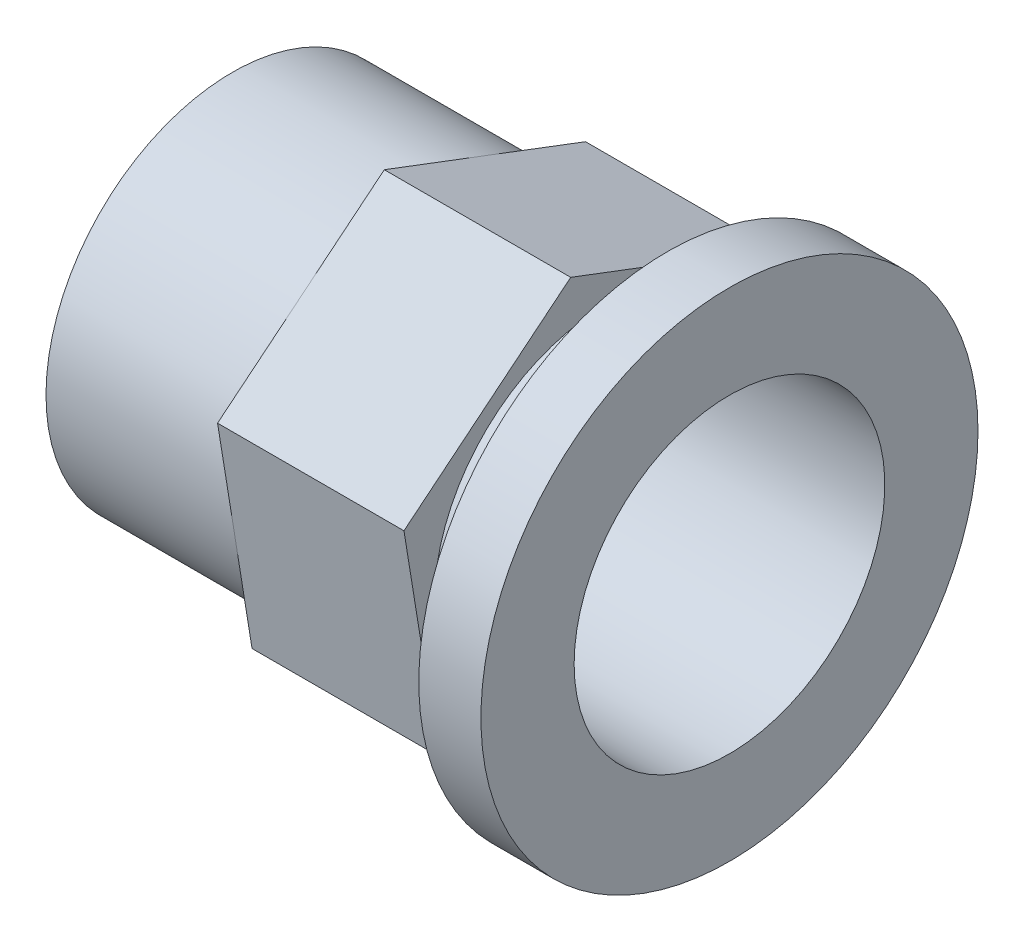
ISO-10303-21;
HEADER;
FILE_DESCRIPTION(('STEP AP214'),'2;1');
FILE_NAME('part.step','',(''),(''),'','','');
FILE_SCHEMA(('AUTOMOTIVE_DESIGN { 1 0 10303 214 1 1 1 1 }'));
ENDSEC;
DATA;
#1=APPLICATION_CONTEXT('core data for automotive mechanical design processes');
#2=APPLICATION_PROTOCOL_DEFINITION('international standard','automotive_design',2000,#1);
#3=PRODUCT_CONTEXT('',#1,'mechanical');
#4=PRODUCT('Part','Part','',(#3));
#5=PRODUCT_RELATED_PRODUCT_CATEGORY('part','',(#4));
#6=PRODUCT_DEFINITION_FORMATION('','',#4);
#7=PRODUCT_DEFINITION_CONTEXT('part definition',#1,'design');
#8=PRODUCT_DEFINITION('design','',#6,#7);
#9=PRODUCT_DEFINITION_SHAPE('','',#8);
#10=(LENGTH_UNIT() NAMED_UNIT(*) SI_UNIT(.MILLI.,.METRE.));
#11=(NAMED_UNIT(*) PLANE_ANGLE_UNIT() SI_UNIT($,.RADIAN.));
#12=(NAMED_UNIT(*) SI_UNIT($,.STERADIAN.) SOLID_ANGLE_UNIT());
#13=UNCERTAINTY_MEASURE_WITH_UNIT(LENGTH_MEASURE(1.E-05),#10,'distance_accuracy_value','');
#14=(GEOMETRIC_REPRESENTATION_CONTEXT(3) GLOBAL_UNCERTAINTY_ASSIGNED_CONTEXT((#13)) GLOBAL_UNIT_ASSIGNED_CONTEXT((#10,
#11,#12)) REPRESENTATION_CONTEXT('',''));
#15=CARTESIAN_POINT('',(0.,0.,0.));
#16=DIRECTION('',(0.,0.,1.));
#17=DIRECTION('',(1.,0.,0.));
#18=AXIS2_PLACEMENT_3D('',#15,#16,#17);
#19=CARTESIAN_POINT('',(3.,0.,0.));
#20=DIRECTION('',(-1.,0.,0.));
#21=DIRECTION('',(0.,0.,1.));
#22=AXIS2_PLACEMENT_3D('',#19,#20,#21);
#23=CYLINDRICAL_SURFACE('',#22,3.);
#24=CARTESIAN_POINT('',(3.,0.,0.));
#25=DIRECTION('',(1.,0.,0.));
#26=DIRECTION('',(0.,0.,-1.));
#27=AXIS2_PLACEMENT_3D('',#24,#25,#26);
#28=CIRCLE('',#27,3.);
#29=CARTESIAN_POINT('',(3.,0.480861162295166,-2.96121133028295));
#30=VERTEX_POINT('',#29);
#31=CARTESIAN_POINT('',(3.,2.80491481914693,-1.06416768290055));
#32=VERTEX_POINT('',#31);
#33=EDGE_CURVE('E48',#30,#32,#28,.T.);
#34=ORIENTED_EDGE('',*,*,#33,.F.);
#35=CARTESIAN_POINT('',(3.,-2.32405365685177,-1.8970436473824));
#36=VERTEX_POINT('',#35);
#37=EDGE_CURVE('E56',#36,#30,#28,.T.);
#38=ORIENTED_EDGE('',*,*,#37,.F.);
#39=CARTESIAN_POINT('',(3.,-2.80491481914693,1.06416768290055));
#40=VERTEX_POINT('',#39);
#41=EDGE_CURVE('E60',#40,#36,#28,.T.);
#42=ORIENTED_EDGE('',*,*,#41,.F.);
#43=CARTESIAN_POINT('',(3.,-0.480861162295166,2.96121133028296));
#44=VERTEX_POINT('',#43);
#45=EDGE_CURVE('E160',#44,#40,#28,.T.);
#46=ORIENTED_EDGE('',*,*,#45,.F.);
#47=CARTESIAN_POINT('',(3.,2.32405365685177,1.8970436473824));
#48=VERTEX_POINT('',#47);
#49=EDGE_CURVE('E156',#48,#44,#28,.T.);
#50=ORIENTED_EDGE('',*,*,#49,.F.);
#51=EDGE_CURVE('E149',#32,#48,#28,.T.);
#52=ORIENTED_EDGE('',*,*,#51,.F.);
#53=EDGE_LOOP('',(#34,#38,#42,#46,#50,#52));
#54=FACE_BOUND('',#53,.T.);
#55=CARTESIAN_POINT('',(0.,0.,0.));
#56=DIRECTION('',(1.,0.,0.));
#57=DIRECTION('',(0.,0.,-1.));
#58=AXIS2_PLACEMENT_3D('',#55,#56,#57);
#59=CIRCLE('',#58,3.);
#60=CARTESIAN_POINT('',(0.,0.,-3.));
#61=VERTEX_POINT('',#60);
#62=EDGE_CURVE('E42',#61,#61,#59,.T.);
#63=ORIENTED_EDGE('',*,*,#62,.T.);
#64=EDGE_LOOP('',(#63));
#65=FACE_BOUND('',#64,.T.);
#66=ADVANCED_FACE('F39',(#54,#65),#23,.T.);
#67=CARTESIAN_POINT('',(0.,0.,0.));
#68=DIRECTION('',(1.,0.,0.));
#69=DIRECTION('',(0.,0.,-1.));
#70=AXIS2_PLACEMENT_3D('',#67,#68,#69);
#71=PLANE('',#70);
#72=CARTESIAN_POINT('',(0.,0.,0.));
#73=DIRECTION('',(-1.,0.,0.));
#74=DIRECTION('',(0.,0.,1.));
#75=AXIS2_PLACEMENT_3D('',#72,#73,#74);
#76=CIRCLE('',#75,2.5);
#77=CARTESIAN_POINT('',(0.,0.,2.5));
#78=VERTEX_POINT('',#77);
#79=EDGE_CURVE('E255',#78,#78,#76,.T.);
#80=ORIENTED_EDGE('',*,*,#79,.F.);
#81=EDGE_LOOP('',(#80));
#82=FACE_BOUND('',#81,.T.);
#83=ORIENTED_EDGE('',*,*,#62,.F.);
#84=EDGE_LOOP('',(#83));
#85=FACE_BOUND('',#84,.T.);
#86=ADVANCED_FACE('F273',(#82,#85),#71,.F.);
#87=CARTESIAN_POINT('',(3.,0.,0.));
#88=DIRECTION('',(1.,0.,0.));
#89=DIRECTION('',(0.,0.,-1.));
#90=AXIS2_PLACEMENT_3D('',#87,#88,#89);
#91=PLANE('',#90);
#92=DIRECTION('',(0.,0.987070443427651,0.160287054098388));
#93=VECTOR('',#92,1.);
#94=CARTESIAN_POINT('',(3.,-1.22879499637107,-3.2388366517769));
#95=LINE('',#94,#93);
#96=CARTESIAN_POINT('',(3.,2.1905173209614,-2.683586008789));
#97=VERTEX_POINT('',#96);
#98=EDGE_CURVE('E229',#30,#97,#95,.T.);
#99=ORIENTED_EDGE('',*,*,#98,.F.);
#100=ORIENTED_EDGE('',*,*,#33,.T.);
#101=DIRECTION('',(0.,0.354722560966851,0.934971606382311));
#102=VECTOR('',#101,1.);
#103=CARTESIAN_POINT('',(3.,2.1905173209614,-2.683586008789));
#104=LINE('',#103,#102);
#105=EDGE_CURVE('E222',#97,#32,#104,.T.);
#106=ORIENTED_EDGE('',*,*,#105,.F.);
#107=EDGE_LOOP('',(#99,#100,#106));
#108=FACE_BOUND('',#107,.T.);
#109=ADVANCED_FACE('F276',(#108),#91,.F.);
#110=CARTESIAN_POINT('',(3.,3.41931231733247,0.5552506429879));
#111=VERTEX_POINT('',#110);
#112=EDGE_CURVE('E218',#32,#111,#104,.T.);
#113=ORIENTED_EDGE('',*,*,#112,.F.);
#114=ORIENTED_EDGE('',*,*,#51,.T.);
#115=DIRECTION('',(0.,-0.632347882460801,0.774684552283922));
#116=VECTOR('',#115,1.);
#117=CARTESIAN_POINT('',(3.,3.41931231733247,0.5552506429879));
#118=LINE('',#117,#116);
#119=EDGE_CURVE('E185',#111,#48,#118,.T.);
#120=ORIENTED_EDGE('',*,*,#119,.F.);
#121=EDGE_LOOP('',(#113,#114,#120));
#122=FACE_BOUND('',#121,.T.);
#123=ADVANCED_FACE('F217',(#122),#91,.F.);
#124=CARTESIAN_POINT('',(3.,1.22879499637107,3.2388366517769));
#125=VERTEX_POINT('',#124);
#126=EDGE_CURVE('E176',#48,#125,#118,.T.);
#127=ORIENTED_EDGE('',*,*,#126,.F.);
#128=ORIENTED_EDGE('',*,*,#49,.T.);
#129=DIRECTION('',(0.,-0.987070443427651,-0.160287054098388));
#130=VECTOR('',#129,1.);
#131=CARTESIAN_POINT('',(3.,1.22879499637107,3.2388366517769));
#132=LINE('',#131,#130);
#133=EDGE_CURVE('E175',#125,#44,#132,.T.);
#134=ORIENTED_EDGE('',*,*,#133,.F.);
#135=EDGE_LOOP('',(#127,#128,#134));
#136=FACE_BOUND('',#135,.T.);
#137=ADVANCED_FACE('F173',(#136),#91,.F.);
#138=CARTESIAN_POINT('',(3.,-2.1905173209614,2.683586008789));
#139=VERTEX_POINT('',#138);
#140=EDGE_CURVE('E178',#44,#139,#132,.T.);
#141=ORIENTED_EDGE('',*,*,#140,.F.);
#142=ORIENTED_EDGE('',*,*,#45,.T.);
#143=DIRECTION('',(0.,-0.354722560966851,-0.934971606382311));
#144=VECTOR('',#143,1.);
#145=CARTESIAN_POINT('',(3.,-2.1905173209614,2.683586008789));
#146=LINE('',#145,#144);
#147=EDGE_CURVE('E132',#139,#40,#146,.T.);
#148=ORIENTED_EDGE('',*,*,#147,.F.);
#149=EDGE_LOOP('',(#141,#142,#148));
#150=FACE_BOUND('',#149,.T.);
#151=ADVANCED_FACE('F179',(#150),#91,.F.);
#152=CARTESIAN_POINT('',(3.,-3.41931231733247,-0.555250642987899));
#153=VERTEX_POINT('',#152);
#154=EDGE_CURVE('E193',#40,#153,#146,.T.);
#155=ORIENTED_EDGE('',*,*,#154,.F.);
#156=ORIENTED_EDGE('',*,*,#41,.T.);
#157=DIRECTION('',(0.,0.632347882460801,-0.774684552283922));
#158=VECTOR('',#157,1.);
#159=CARTESIAN_POINT('',(3.,-3.41931231733247,-0.555250642987899));
#160=LINE('',#159,#158);
#161=EDGE_CURVE('E230',#153,#36,#160,.T.);
#162=ORIENTED_EDGE('',*,*,#161,.F.);
#163=EDGE_LOOP('',(#155,#156,#162));
#164=FACE_BOUND('',#163,.T.);
#165=ADVANCED_FACE('F311',(#164),#91,.F.);
#166=CARTESIAN_POINT('',(3.,-1.22879499637107,-3.2388366517769));
#167=VERTEX_POINT('',#166);
#168=EDGE_CURVE('E137',#36,#167,#160,.T.);
#169=ORIENTED_EDGE('',*,*,#168,.F.);
#170=ORIENTED_EDGE('',*,*,#37,.T.);
#171=EDGE_CURVE('E225',#167,#30,#95,.T.);
#172=ORIENTED_EDGE('',*,*,#171,.F.);
#173=EDGE_LOOP('',(#169,#170,#172));
#174=FACE_BOUND('',#173,.T.);
#175=ADVANCED_FACE('F295',(#174),#91,.F.);
#176=CARTESIAN_POINT('',(6.,-3.41931231733247,-0.555250642987899));
#177=DIRECTION('',(0.,0.774684552283922,0.632347882460801));
#178=DIRECTION('',(0.,-0.632347882460801,0.774684552283922));
#179=AXIS2_PLACEMENT_3D('',#176,#177,#178);
#180=PLANE('',#179);
#181=ORIENTED_EDGE('',*,*,#161,.T.);
#182=ORIENTED_EDGE('',*,*,#168,.T.);
#183=DIRECTION('',(-1.,0.,0.));
#184=VECTOR('',#183,1.);
#185=CARTESIAN_POINT('',(6.,-1.22879499637107,-3.2388366517769));
#186=LINE('',#185,#184);
#187=CARTESIAN_POINT('',(6.,-1.22879499637107,-3.2388366517769));
#188=VERTEX_POINT('',#187);
#189=EDGE_CURVE('E115',#188,#167,#186,.T.);
#190=ORIENTED_EDGE('',*,*,#189,.F.);
#191=DIRECTION('',(0.,0.632347882460801,-0.774684552283922));
#192=VECTOR('',#191,1.);
#193=CARTESIAN_POINT('',(6.,-3.41931231733247,-0.555250642987899));
#194=LINE('',#193,#192);
#195=CARTESIAN_POINT('',(6.,-3.41931231733247,-0.555250642987899));
#196=VERTEX_POINT('',#195);
#197=EDGE_CURVE('E122',#196,#188,#194,.T.);
#198=ORIENTED_EDGE('',*,*,#197,.F.);
#199=DIRECTION('',(-1.,0.,0.));
#200=VECTOR('',#199,1.);
#201=CARTESIAN_POINT('',(6.,-3.41931231733247,-0.555250642987899));
#202=LINE('',#201,#200);
#203=EDGE_CURVE('E200',#196,#153,#202,.T.);
#204=ORIENTED_EDGE('',*,*,#203,.T.);
#205=EDGE_LOOP('',(#181,#182,#190,#198,#204));
#206=FACE_BOUND('',#205,.T.);
#207=ADVANCED_FACE('F135',(#206),#180,.F.);
#208=CARTESIAN_POINT('',(6.,-1.22879499637107,-3.2388366517769));
#209=DIRECTION('',(0.,-0.160287054098388,0.987070443427651));
#210=DIRECTION('',(0.,-0.987070443427652,-0.160287054098388));
#211=AXIS2_PLACEMENT_3D('',#208,#209,#210);
#212=PLANE('',#211);
#213=ORIENTED_EDGE('',*,*,#171,.T.);
#214=ORIENTED_EDGE('',*,*,#98,.T.);
#215=DIRECTION('',(-1.,0.,0.));
#216=VECTOR('',#215,1.);
#217=CARTESIAN_POINT('',(6.,2.1905173209614,-2.683586008789));
#218=LINE('',#217,#216);
#219=CARTESIAN_POINT('',(6.,2.1905173209614,-2.683586008789));
#220=VERTEX_POINT('',#219);
#221=EDGE_CURVE('E117',#220,#97,#218,.T.);
#222=ORIENTED_EDGE('',*,*,#221,.F.);
#223=DIRECTION('',(0.,0.987070443427651,0.160287054098388));
#224=VECTOR('',#223,1.);
#225=CARTESIAN_POINT('',(6.,-1.22879499637107,-3.2388366517769));
#226=LINE('',#225,#224);
#227=EDGE_CURVE('E110',#188,#220,#226,.T.);
#228=ORIENTED_EDGE('',*,*,#227,.F.);
#229=ORIENTED_EDGE('',*,*,#189,.T.);
#230=EDGE_LOOP('',(#213,#214,#222,#228,#229));
#231=FACE_BOUND('',#230,.T.);
#232=ADVANCED_FACE('F113',(#231),#212,.F.);
#233=CARTESIAN_POINT('',(6.,2.1905173209614,-2.683586008789));
#234=DIRECTION('',(0.,-0.934971606382311,0.354722560966851));
#235=DIRECTION('',(0.,-0.354722560966851,-0.934971606382311));
#236=AXIS2_PLACEMENT_3D('',#233,#234,#235);
#237=PLANE('',#236);
#238=ORIENTED_EDGE('',*,*,#105,.T.);
#239=ORIENTED_EDGE('',*,*,#112,.T.);
#240=DIRECTION('',(-1.,0.,0.));
#241=VECTOR('',#240,1.);
#242=CARTESIAN_POINT('',(6.,3.41931231733247,0.5552506429879));
#243=LINE('',#242,#241);
#244=CARTESIAN_POINT('',(6.,3.41931231733247,0.5552506429879));
#245=VERTEX_POINT('',#244);
#246=EDGE_CURVE('E144',#245,#111,#243,.T.);
#247=ORIENTED_EDGE('',*,*,#246,.F.);
#248=DIRECTION('',(0.,0.354722560966851,0.934971606382311));
#249=VECTOR('',#248,1.);
#250=CARTESIAN_POINT('',(6.,2.1905173209614,-2.683586008789));
#251=LINE('',#250,#249);
#252=EDGE_CURVE('E121',#220,#245,#251,.T.);
#253=ORIENTED_EDGE('',*,*,#252,.F.);
#254=ORIENTED_EDGE('',*,*,#221,.T.);
#255=EDGE_LOOP('',(#238,#239,#247,#253,#254));
#256=FACE_BOUND('',#255,.T.);
#257=ADVANCED_FACE('F333',(#256),#237,.F.);
#258=CARTESIAN_POINT('',(6.,3.41931231733247,0.5552506429879));
#259=DIRECTION('',(0.,-0.774684552283922,-0.632347882460801));
#260=DIRECTION('',(0.,0.632347882460801,-0.774684552283922));
#261=AXIS2_PLACEMENT_3D('',#258,#259,#260);
#262=PLANE('',#261);
#263=ORIENTED_EDGE('',*,*,#119,.T.);
#264=ORIENTED_EDGE('',*,*,#126,.T.);
#265=DIRECTION('',(-1.,0.,0.));
#266=VECTOR('',#265,1.);
#267=CARTESIAN_POINT('',(6.,1.22879499637107,3.2388366517769));
#268=LINE('',#267,#266);
#269=CARTESIAN_POINT('',(6.,1.22879499637107,3.2388366517769));
#270=VERTEX_POINT('',#269);
#271=EDGE_CURVE('E191',#270,#125,#268,.T.);
#272=ORIENTED_EDGE('',*,*,#271,.F.);
#273=DIRECTION('',(0.,-0.632347882460801,0.774684552283922));
#274=VECTOR('',#273,1.);
#275=CARTESIAN_POINT('',(6.,3.41931231733247,0.5552506429879));
#276=LINE('',#275,#274);
#277=EDGE_CURVE('E214',#245,#270,#276,.T.);
#278=ORIENTED_EDGE('',*,*,#277,.F.);
#279=ORIENTED_EDGE('',*,*,#246,.T.);
#280=EDGE_LOOP('',(#263,#264,#272,#278,#279));
#281=FACE_BOUND('',#280,.T.);
#282=ADVANCED_FACE('F213',(#281),#262,.F.);
#283=CARTESIAN_POINT('',(6.,1.22879499637107,3.2388366517769));
#284=DIRECTION('',(0.,0.160287054098388,-0.987070443427651));
#285=DIRECTION('',(0.,0.987070443427651,0.160287054098388));
#286=AXIS2_PLACEMENT_3D('',#283,#284,#285);
#287=PLANE('',#286);
#288=ORIENTED_EDGE('',*,*,#133,.T.);
#289=ORIENTED_EDGE('',*,*,#140,.T.);
#290=DIRECTION('',(-1.,0.,0.));
#291=VECTOR('',#290,1.);
#292=CARTESIAN_POINT('',(6.,-2.1905173209614,2.683586008789));
#293=LINE('',#292,#291);
#294=CARTESIAN_POINT('',(6.,-2.1905173209614,2.683586008789));
#295=VERTEX_POINT('',#294);
#296=EDGE_CURVE('E203',#295,#139,#293,.T.);
#297=ORIENTED_EDGE('',*,*,#296,.F.);
#298=DIRECTION('',(0.,-0.987070443427651,-0.160287054098388));
#299=VECTOR('',#298,1.);
#300=CARTESIAN_POINT('',(6.,1.22879499637107,3.2388366517769));
#301=LINE('',#300,#299);
#302=EDGE_CURVE('E235',#270,#295,#301,.T.);
#303=ORIENTED_EDGE('',*,*,#302,.F.);
#304=ORIENTED_EDGE('',*,*,#271,.T.);
#305=EDGE_LOOP('',(#288,#289,#297,#303,#304));
#306=FACE_BOUND('',#305,.T.);
#307=ADVANCED_FACE('F188',(#306),#287,.F.);
#308=CARTESIAN_POINT('',(6.,-2.1905173209614,2.683586008789));
#309=DIRECTION('',(0.,0.934971606382311,-0.354722560966851));
#310=DIRECTION('',(0.,0.354722560966851,0.934971606382311));
#311=AXIS2_PLACEMENT_3D('',#308,#309,#310);
#312=PLANE('',#311);
#313=ORIENTED_EDGE('',*,*,#147,.T.);
#314=ORIENTED_EDGE('',*,*,#154,.T.);
#315=ORIENTED_EDGE('',*,*,#203,.F.);
#316=DIRECTION('',(0.,-0.354722560966851,-0.934971606382311));
#317=VECTOR('',#316,1.);
#318=CARTESIAN_POINT('',(6.,-2.1905173209614,2.683586008789));
#319=LINE('',#318,#317);
#320=EDGE_CURVE('E127',#295,#196,#319,.T.);
#321=ORIENTED_EDGE('',*,*,#320,.F.);
#322=ORIENTED_EDGE('',*,*,#296,.T.);
#323=EDGE_LOOP('',(#313,#314,#315,#321,#322));
#324=FACE_BOUND('',#323,.T.);
#325=ADVANCED_FACE('F352',(#324),#312,.F.);
#326=CARTESIAN_POINT('',(6.,0.,0.));
#327=DIRECTION('',(1.,0.,0.));
#328=DIRECTION('',(0.,0.,-1.));
#329=AXIS2_PLACEMENT_3D('',#326,#327,#328);
#330=PLANE('',#329);
#331=CARTESIAN_POINT('',(6.,0.,0.));
#332=DIRECTION('',(1.,0.,0.));
#333=DIRECTION('',(0.,0.,-1.));
#334=AXIS2_PLACEMENT_3D('',#331,#332,#333);
#335=CIRCLE('',#334,2.75);
#336=CARTESIAN_POINT('',(6.,0.,-2.75));
#337=VERTEX_POINT('',#336);
#338=EDGE_CURVE('E11',#337,#337,#335,.T.);
#339=ORIENTED_EDGE('',*,*,#338,.F.);
#340=EDGE_LOOP('',(#339));
#341=FACE_BOUND('',#340,.T.);
#342=ORIENTED_EDGE('',*,*,#197,.T.);
#343=ORIENTED_EDGE('',*,*,#227,.T.);
#344=ORIENTED_EDGE('',*,*,#252,.T.);
#345=ORIENTED_EDGE('',*,*,#277,.T.);
#346=ORIENTED_EDGE('',*,*,#302,.T.);
#347=ORIENTED_EDGE('',*,*,#320,.T.);
#348=EDGE_LOOP('',(#342,#343,#344,#345,#346,#347));
#349=FACE_BOUND('',#348,.T.);
#350=ADVANCED_FACE('F125',(#341,#349),#330,.T.);
#351=CARTESIAN_POINT('',(7.,0.,0.));
#352=DIRECTION('',(-1.,0.,0.));
#353=DIRECTION('',(0.,0.,1.));
#354=AXIS2_PLACEMENT_3D('',#351,#352,#353);
#355=CYLINDRICAL_SURFACE('',#354,2.75);
#356=CARTESIAN_POINT('',(7.,0.,0.));
#357=DIRECTION('',(1.,0.,0.));
#358=DIRECTION('',(0.,0.,-1.));
#359=AXIS2_PLACEMENT_3D('',#356,#357,#358);
#360=CIRCLE('',#359,2.75);
#361=CARTESIAN_POINT('',(7.,0.,-2.75));
#362=VERTEX_POINT('',#361);
#363=EDGE_CURVE('E242',#362,#362,#360,.T.);
#364=ORIENTED_EDGE('',*,*,#363,.F.);
#365=EDGE_LOOP('',(#364));
#366=FACE_BOUND('',#365,.T.);
#367=ORIENTED_EDGE('',*,*,#338,.T.);
#368=EDGE_LOOP('',(#367));
#369=FACE_BOUND('',#368,.T.);
#370=ADVANCED_FACE('F366',(#366,#369),#355,.T.);
#371=CARTESIAN_POINT('',(8.,0.,0.));
#372=DIRECTION('',(-1.,0.,0.));
#373=DIRECTION('',(0.,0.,1.));
#374=AXIS2_PLACEMENT_3D('',#371,#372,#373);
#375=CYLINDRICAL_SURFACE('',#374,4.);
#376=CARTESIAN_POINT('',(8.,0.,0.));
#377=DIRECTION('',(1.,0.,0.));
#378=DIRECTION('',(0.,0.,-1.));
#379=AXIS2_PLACEMENT_3D('',#376,#377,#378);
#380=CIRCLE('',#379,4.);
#381=CARTESIAN_POINT('',(8.,0.,-4.));
#382=VERTEX_POINT('',#381);
#383=EDGE_CURVE('E246',#382,#382,#380,.T.);
#384=ORIENTED_EDGE('',*,*,#383,.F.);
#385=EDGE_LOOP('',(#384));
#386=FACE_BOUND('',#385,.T.);
#387=CARTESIAN_POINT('',(7.,0.,0.));
#388=DIRECTION('',(1.,0.,0.));
#389=DIRECTION('',(0.,0.,-1.));
#390=AXIS2_PLACEMENT_3D('',#387,#388,#389);
#391=CIRCLE('',#390,4.);
#392=CARTESIAN_POINT('',(7.,0.,-4.));
#393=VERTEX_POINT('',#392);
#394=EDGE_CURVE('E247',#393,#393,#391,.T.);
#395=ORIENTED_EDGE('',*,*,#394,.T.);
#396=EDGE_LOOP('',(#395));
#397=FACE_BOUND('',#396,.T.);
#398=ADVANCED_FACE('F374',(#386,#397),#375,.T.);
#399=CARTESIAN_POINT('',(8.,0.,0.));
#400=DIRECTION('',(1.,0.,0.));
#401=DIRECTION('',(0.,0.,-1.));
#402=AXIS2_PLACEMENT_3D('',#399,#400,#401);
#403=PLANE('',#402);
#404=CARTESIAN_POINT('',(8.,0.,0.));
#405=DIRECTION('',(-1.,0.,0.));
#406=DIRECTION('',(0.,0.,1.));
#407=AXIS2_PLACEMENT_3D('',#404,#405,#406);
#408=CIRCLE('',#407,2.5);
#409=CARTESIAN_POINT('',(8.,0.,2.5));
#410=VERTEX_POINT('',#409);
#411=EDGE_CURVE('E251',#410,#410,#408,.T.);
#412=ORIENTED_EDGE('',*,*,#411,.T.);
#413=EDGE_LOOP('',(#412));
#414=FACE_BOUND('',#413,.T.);
#415=ORIENTED_EDGE('',*,*,#383,.T.);
#416=EDGE_LOOP('',(#415));
#417=FACE_BOUND('',#416,.T.);
#418=ADVANCED_FACE('F263',(#414,#417),#403,.T.);
#419=CARTESIAN_POINT('',(7.,0.,0.));
#420=DIRECTION('',(1.,0.,0.));
#421=DIRECTION('',(0.,0.,-1.));
#422=AXIS2_PLACEMENT_3D('',#419,#420,#421);
#423=PLANE('',#422);
#424=ORIENTED_EDGE('',*,*,#363,.T.);
#425=EDGE_LOOP('',(#424));
#426=FACE_BOUND('',#425,.T.);
#427=ORIENTED_EDGE('',*,*,#394,.F.);
#428=EDGE_LOOP('',(#427));
#429=FACE_BOUND('',#428,.T.);
#430=ADVANCED_FACE('F269',(#426,#429),#423,.F.);
#431=CARTESIAN_POINT('',(8.,0.,0.));
#432=DIRECTION('',(-1.,0.,0.));
#433=DIRECTION('',(0.,0.,1.));
#434=AXIS2_PLACEMENT_3D('',#431,#432,#433);
#435=CYLINDRICAL_SURFACE('',#434,2.5);
#436=ORIENTED_EDGE('',*,*,#411,.F.);
#437=EDGE_LOOP('',(#436));
#438=FACE_BOUND('',#437,.T.);
#439=ORIENTED_EDGE('',*,*,#79,.T.);
#440=EDGE_LOOP('',(#439));
#441=FACE_BOUND('',#440,.T.);
#442=ADVANCED_FACE('F266',(#438,#441),#435,.F.);
#443=CLOSED_SHELL('',(#66,#86,#109,#123,#137,#151,#165,#175,#207,#232,#257,#282,#307,#325,#350,
#370,#398,#418,#430,#442));
#444=MANIFOLD_SOLID_BREP('B2',#443);
#445=ADVANCED_BREP_SHAPE_REPRESENTATION('',(#18,#444),#14);
#446=SHAPE_DEFINITION_REPRESENTATION(#9,#445);
ENDSEC;
END-ISO-10303-21;
